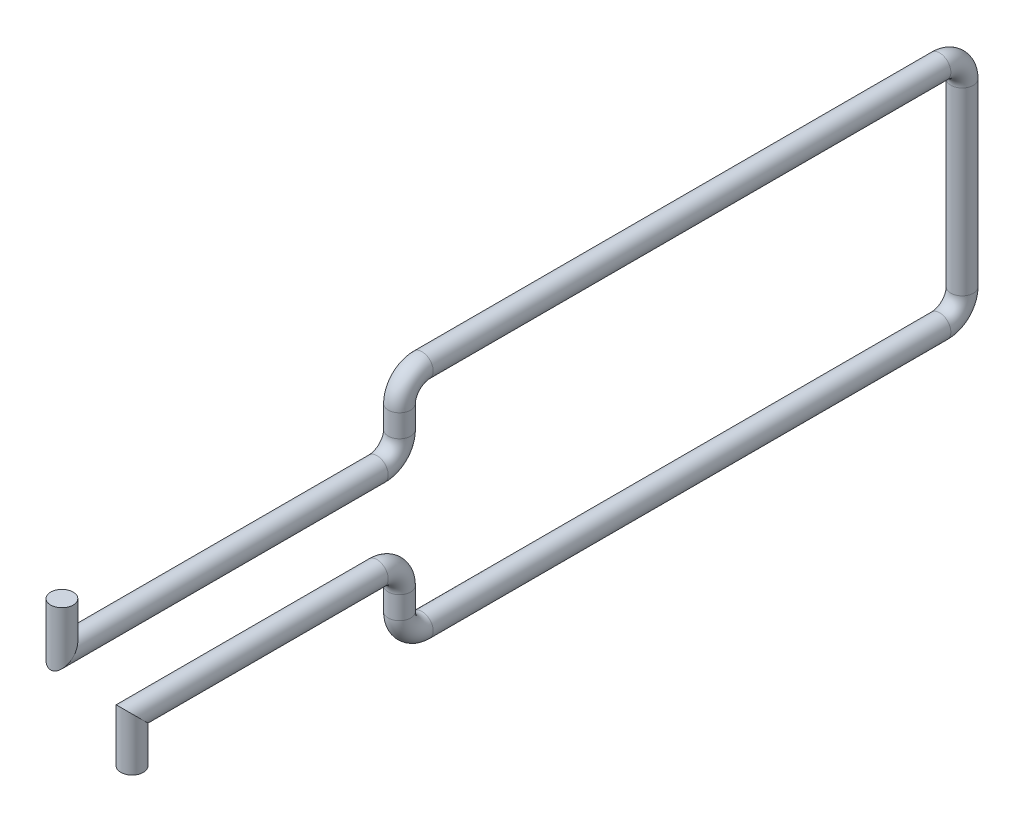
ISO-10303-21;
HEADER;
FILE_DESCRIPTION(('STEP AP214'),'2;1');
FILE_NAME('part.step','',(''),(''),'','','');
FILE_SCHEMA(('AUTOMOTIVE_DESIGN { 1 0 10303 214 1 1 1 1 }'));
ENDSEC;
DATA;
#1=APPLICATION_CONTEXT('core data for automotive mechanical design processes');
#2=APPLICATION_PROTOCOL_DEFINITION('international standard','automotive_design',2000,#1);
#3=PRODUCT_CONTEXT('',#1,'mechanical');
#4=PRODUCT('Part','Part','',(#3));
#5=PRODUCT_RELATED_PRODUCT_CATEGORY('part','',(#4));
#6=PRODUCT_DEFINITION_FORMATION('','',#4);
#7=PRODUCT_DEFINITION_CONTEXT('part definition',#1,'design');
#8=PRODUCT_DEFINITION('design','',#6,#7);
#9=PRODUCT_DEFINITION_SHAPE('','',#8);
#10=(LENGTH_UNIT() NAMED_UNIT(*) SI_UNIT(.MILLI.,.METRE.));
#11=(NAMED_UNIT(*) PLANE_ANGLE_UNIT() SI_UNIT($,.RADIAN.));
#12=(NAMED_UNIT(*) SI_UNIT($,.STERADIAN.) SOLID_ANGLE_UNIT());
#13=UNCERTAINTY_MEASURE_WITH_UNIT(LENGTH_MEASURE(1.E-05),#10,'distance_accuracy_value','');
#14=(GEOMETRIC_REPRESENTATION_CONTEXT(3) GLOBAL_UNCERTAINTY_ASSIGNED_CONTEXT((#13)) GLOBAL_UNIT_ASSIGNED_CONTEXT((#10,
#11,#12)) REPRESENTATION_CONTEXT('',''));
#15=CARTESIAN_POINT('',(0.,0.,0.));
#16=DIRECTION('',(0.,0.,1.));
#17=DIRECTION('',(1.,0.,0.));
#18=AXIS2_PLACEMENT_3D('',#15,#16,#17);
#19=CARTESIAN_POINT('',(0.,-4.00000000000001,-6.23488243508064));
#20=DIRECTION('',(0.,-1.,0.));
#21=DIRECTION('',(0.,0.,-1.));
#22=AXIS2_PLACEMENT_3D('',#19,#20,#21);
#23=CYLINDRICAL_SURFACE('',#22,1.);
#24=CARTESIAN_POINT('',(0.,-4.00000000000001,-6.23488243508064));
#25=DIRECTION('',(0.,-0.707106781186548,0.707106781186547));
#26=DIRECTION('',(0.,0.707106781186547,0.707106781186548));
#27=AXIS2_PLACEMENT_3D('',#24,#25,#26);
#28=ELLIPSE('',#27,1.4142135623731,1.);
#29=CARTESIAN_POINT('',(0.,-3.00000000000001,-5.23488243508063));
#30=VERTEX_POINT('',#29);
#31=EDGE_CURVE('E40',#30,#30,#28,.F.);
#32=ORIENTED_EDGE('',*,*,#31,.F.);
#33=EDGE_LOOP('',(#32));
#34=FACE_BOUND('',#33,.T.);
#35=CARTESIAN_POINT('',(0.,-8.00000000000001,-6.23488243508064));
#36=DIRECTION('',(0.,-1.,0.));
#37=DIRECTION('',(0.,0.,-1.));
#38=AXIS2_PLACEMENT_3D('',#35,#36,#37);
#39=CIRCLE('',#38,1.);
#40=CARTESIAN_POINT('',(0.,-8.00000000000001,-7.23488243508064));
#41=VERTEX_POINT('',#40);
#42=EDGE_CURVE('E11',#41,#41,#39,.T.);
#43=ORIENTED_EDGE('',*,*,#42,.F.);
#44=EDGE_LOOP('',(#43));
#45=FACE_BOUND('',#44,.T.);
#46=ADVANCED_FACE('F34',(#34,#45),#23,.T.);
#47=CARTESIAN_POINT('',(0.,-4.00000000000001,-28.));
#48=DIRECTION('',(0.,0.,1.));
#49=DIRECTION('',(0.,-1.,0.));
#50=AXIS2_PLACEMENT_3D('',#47,#48,#49);
#51=CYLINDRICAL_SURFACE('',#50,1.);
#52=CARTESIAN_POINT('',(0.,-4.00000000000001,-28.));
#53=DIRECTION('',(0.,0.,1.));
#54=DIRECTION('',(0.,-1.,0.));
#55=AXIS2_PLACEMENT_3D('',#52,#53,#54);
#56=CIRCLE('',#55,1.);
#57=CARTESIAN_POINT('',(0.,-3.00000000000001,-28.));
#58=VERTEX_POINT('',#57);
#59=EDGE_CURVE('E44',#58,#58,#56,.T.);
#60=ORIENTED_EDGE('',*,*,#59,.T.);
#61=EDGE_LOOP('',(#60));
#62=FACE_BOUND('',#61,.T.);
#63=ORIENTED_EDGE('',*,*,#31,.T.);
#64=EDGE_LOOP('',(#63));
#65=FACE_BOUND('',#64,.T.);
#66=ADVANCED_FACE('F168',(#62,#65),#51,.T.);
#67=CARTESIAN_POINT('',(0.,-6.00000000000001,-28.));
#68=DIRECTION('',(1.,0.,0.));
#69=DIRECTION('',(0.,0.,-1.));
#70=AXIS2_PLACEMENT_3D('',#67,#68,#69);
#71=TOROIDAL_SURFACE('',#70,2.,1.);
#72=CARTESIAN_POINT('',(0.,-6.00000000000006,-30.));
#73=DIRECTION('',(0.,1.,0.));
#74=DIRECTION('',(0.,0.,1.));
#75=AXIS2_PLACEMENT_3D('',#72,#73,#74);
#76=CIRCLE('',#75,1.);
#77=CARTESIAN_POINT('',(0.,-6.00000000000008,-31.));
#78=VERTEX_POINT('',#77);
#79=EDGE_CURVE('E48',#78,#78,#76,.T.);
#80=CARTESIAN_POINT('',(0.,-6.00000000000001,-28.));
#81=DIRECTION('',(1.,0.,0.));
#82=DIRECTION('',(0.,0.,-1.));
#83=AXIS2_PLACEMENT_3D('',#80,#81,#82);
#84=CIRCLE('',#83,3.);
#85=EDGE_CURVE('',#78,#58,#84,.T.);
#86=ORIENTED_EDGE('',*,*,#79,.T.);
#87=ORIENTED_EDGE('',*,*,#59,.F.);
#88=ORIENTED_EDGE('',*,*,#85,.T.);
#89=ORIENTED_EDGE('',*,*,#85,.F.);
#90=EDGE_LOOP('',(#86,#88,#87,#89));
#91=FACE_BOUND('',#90,.T.);
#92=ADVANCED_FACE('F162',(#91),#71,.T.);
#93=CARTESIAN_POINT('',(0.,-8.00000000000002,-30.));
#94=DIRECTION('',(0.,1.,0.));
#95=DIRECTION('',(0.,0.,1.));
#96=AXIS2_PLACEMENT_3D('',#93,#94,#95);
#97=CYLINDRICAL_SURFACE('',#96,1.);
#98=CARTESIAN_POINT('',(0.,-8.00000000000002,-30.));
#99=DIRECTION('',(0.,1.,0.));
#100=DIRECTION('',(0.,0.,1.));
#101=AXIS2_PLACEMENT_3D('',#98,#99,#100);
#102=CIRCLE('',#101,1.);
#103=CARTESIAN_POINT('',(0.,-8.00000000000003,-29.));
#104=VERTEX_POINT('',#103);
#105=EDGE_CURVE('E53',#104,#104,#102,.T.);
#106=ORIENTED_EDGE('',*,*,#105,.T.);
#107=EDGE_LOOP('',(#106));
#108=FACE_BOUND('',#107,.T.);
#109=ORIENTED_EDGE('',*,*,#79,.F.);
#110=EDGE_LOOP('',(#109));
#111=FACE_BOUND('',#110,.T.);
#112=ADVANCED_FACE('F156',(#108,#111),#97,.T.);
#113=CARTESIAN_POINT('',(0.,-8.00000000000001,-32.));
#114=DIRECTION('',(-1.,0.,0.));
#115=DIRECTION('',(0.,0.,1.));
#116=AXIS2_PLACEMENT_3D('',#113,#114,#115);
#117=TOROIDAL_SURFACE('',#116,2.00000000000001,1.);
#118=CARTESIAN_POINT('',(0.,-10.,-32.));
#119=DIRECTION('',(0.,0.,1.));
#120=DIRECTION('',(0.,-1.,0.));
#121=AXIS2_PLACEMENT_3D('',#118,#119,#120);
#122=CIRCLE('',#121,1.);
#123=CARTESIAN_POINT('',(0.,-11.,-32.0000000000001));
#124=VERTEX_POINT('',#123);
#125=EDGE_CURVE('E56',#124,#124,#122,.T.);
#126=CARTESIAN_POINT('',(0.,-8.00000000000001,-32.));
#127=DIRECTION('',(-1.,0.,0.));
#128=DIRECTION('',(0.,0.,1.));
#129=AXIS2_PLACEMENT_3D('',#126,#127,#128);
#130=CIRCLE('',#129,3.00000000000001);
#131=EDGE_CURVE('',#124,#104,#130,.T.);
#132=ORIENTED_EDGE('',*,*,#125,.T.);
#133=ORIENTED_EDGE('',*,*,#105,.F.);
#134=ORIENTED_EDGE('',*,*,#131,.T.);
#135=ORIENTED_EDGE('',*,*,#131,.F.);
#136=EDGE_LOOP('',(#132,#134,#133,#135));
#137=FACE_BOUND('',#136,.T.);
#138=ADVANCED_FACE('F150',(#137),#117,.T.);
#139=CARTESIAN_POINT('',(0.,-10.,-78.));
#140=DIRECTION('',(0.,0.,1.));
#141=DIRECTION('',(0.,-1.,0.));
#142=AXIS2_PLACEMENT_3D('',#139,#140,#141);
#143=CYLINDRICAL_SURFACE('',#142,1.);
#144=CARTESIAN_POINT('',(0.,-10.,-78.));
#145=DIRECTION('',(0.,0.,1.));
#146=DIRECTION('',(0.,-1.,0.));
#147=AXIS2_PLACEMENT_3D('',#144,#145,#146);
#148=CIRCLE('',#147,1.);
#149=CARTESIAN_POINT('',(0.,-11.,-78.));
#150=VERTEX_POINT('',#149);
#151=EDGE_CURVE('E59',#150,#150,#148,.T.);
#152=ORIENTED_EDGE('',*,*,#151,.T.);
#153=EDGE_LOOP('',(#152));
#154=FACE_BOUND('',#153,.T.);
#155=ORIENTED_EDGE('',*,*,#125,.F.);
#156=EDGE_LOOP('',(#155));
#157=FACE_BOUND('',#156,.T.);
#158=ADVANCED_FACE('F144',(#154,#157),#143,.T.);
#159=CARTESIAN_POINT('',(0.,-8.,-78.));
#160=DIRECTION('',(-1.,0.,0.));
#161=DIRECTION('',(0.,0.,1.));
#162=AXIS2_PLACEMENT_3D('',#159,#160,#161);
#163=TOROIDAL_SURFACE('',#162,2.,1.);
#164=CARTESIAN_POINT('',(0.,-7.99999999999998,-80.));
#165=DIRECTION('',(0.,-1.,0.));
#166=DIRECTION('',(0.,0.,-1.));
#167=AXIS2_PLACEMENT_3D('',#164,#165,#166);
#168=CIRCLE('',#167,1.);
#169=CARTESIAN_POINT('',(0.,-7.99999999999997,-81.));
#170=VERTEX_POINT('',#169);
#171=EDGE_CURVE('E62',#170,#170,#168,.T.);
#172=CARTESIAN_POINT('',(0.,-8.,-78.));
#173=DIRECTION('',(-1.,0.,0.));
#174=DIRECTION('',(0.,0.,1.));
#175=AXIS2_PLACEMENT_3D('',#172,#173,#174);
#176=CIRCLE('',#175,3.);
#177=EDGE_CURVE('',#170,#150,#176,.T.);
#178=ORIENTED_EDGE('',*,*,#171,.T.);
#179=ORIENTED_EDGE('',*,*,#151,.F.);
#180=ORIENTED_EDGE('',*,*,#177,.T.);
#181=ORIENTED_EDGE('',*,*,#177,.F.);
#182=EDGE_LOOP('',(#178,#180,#179,#181));
#183=FACE_BOUND('',#182,.T.);
#184=ADVANCED_FACE('F138',(#183),#163,.T.);
#185=CARTESIAN_POINT('',(0.,7.99999999999999,-80.));
#186=DIRECTION('',(0.,-1.,0.));
#187=DIRECTION('',(0.,0.,-1.));
#188=AXIS2_PLACEMENT_3D('',#185,#186,#187);
#189=CYLINDRICAL_SURFACE('',#188,1.);
#190=CARTESIAN_POINT('',(0.,7.99999999999999,-80.));
#191=DIRECTION('',(0.,-1.,0.));
#192=DIRECTION('',(0.,0.,-1.));
#193=AXIS2_PLACEMENT_3D('',#190,#191,#192);
#194=CIRCLE('',#193,1.);
#195=CARTESIAN_POINT('',(0.,7.99999999999999,-81.));
#196=VERTEX_POINT('',#195);
#197=EDGE_CURVE('E65',#196,#196,#194,.T.);
#198=ORIENTED_EDGE('',*,*,#197,.T.);
#199=EDGE_LOOP('',(#198));
#200=FACE_BOUND('',#199,.T.);
#201=ORIENTED_EDGE('',*,*,#171,.F.);
#202=EDGE_LOOP('',(#201));
#203=FACE_BOUND('',#202,.T.);
#204=ADVANCED_FACE('F132',(#200,#203),#189,.T.);
#205=CARTESIAN_POINT('',(0.,8.,-78.));
#206=DIRECTION('',(-1.,0.,0.));
#207=DIRECTION('',(0.,0.,1.));
#208=AXIS2_PLACEMENT_3D('',#205,#206,#207);
#209=TOROIDAL_SURFACE('',#208,2.,1.);
#210=CARTESIAN_POINT('',(0.,10.,-78.));
#211=DIRECTION('',(0.,0.,-1.));
#212=DIRECTION('',(0.,1.,0.));
#213=AXIS2_PLACEMENT_3D('',#210,#211,#212);
#214=CIRCLE('',#213,1.);
#215=CARTESIAN_POINT('',(0.,11.,-78.));
#216=VERTEX_POINT('',#215);
#217=EDGE_CURVE('E68',#216,#216,#214,.T.);
#218=CARTESIAN_POINT('',(0.,8.,-78.));
#219=DIRECTION('',(-1.,0.,0.));
#220=DIRECTION('',(0.,0.,1.));
#221=AXIS2_PLACEMENT_3D('',#218,#219,#220);
#222=CIRCLE('',#221,3.);
#223=EDGE_CURVE('',#216,#196,#222,.T.);
#224=ORIENTED_EDGE('',*,*,#217,.T.);
#225=ORIENTED_EDGE('',*,*,#197,.F.);
#226=ORIENTED_EDGE('',*,*,#223,.T.);
#227=ORIENTED_EDGE('',*,*,#223,.F.);
#228=EDGE_LOOP('',(#224,#226,#225,#227));
#229=FACE_BOUND('',#228,.T.);
#230=ADVANCED_FACE('F126',(#229),#209,.T.);
#231=CARTESIAN_POINT('',(0.,10.,-32.));
#232=DIRECTION('',(0.,0.,-1.));
#233=DIRECTION('',(0.,1.,0.));
#234=AXIS2_PLACEMENT_3D('',#231,#232,#233);
#235=CYLINDRICAL_SURFACE('',#234,1.);
#236=CARTESIAN_POINT('',(0.,10.,-32.));
#237=DIRECTION('',(0.,0.,-1.));
#238=DIRECTION('',(0.,1.,0.));
#239=AXIS2_PLACEMENT_3D('',#236,#237,#238);
#240=CIRCLE('',#239,1.);
#241=CARTESIAN_POINT('',(0.,11.,-32.));
#242=VERTEX_POINT('',#241);
#243=EDGE_CURVE('E71',#242,#242,#240,.T.);
#244=ORIENTED_EDGE('',*,*,#243,.T.);
#245=EDGE_LOOP('',(#244));
#246=FACE_BOUND('',#245,.T.);
#247=ORIENTED_EDGE('',*,*,#217,.F.);
#248=EDGE_LOOP('',(#247));
#249=FACE_BOUND('',#248,.T.);
#250=ADVANCED_FACE('F120',(#246,#249),#235,.T.);
#251=CARTESIAN_POINT('',(0.,8.,-32.));
#252=DIRECTION('',(-1.,0.,0.));
#253=DIRECTION('',(0.,0.,1.));
#254=AXIS2_PLACEMENT_3D('',#251,#252,#253);
#255=TOROIDAL_SURFACE('',#254,2.,1.);
#256=CARTESIAN_POINT('',(0.,7.99999999999999,-30.));
#257=DIRECTION('',(0.,1.,0.));
#258=DIRECTION('',(0.,0.,1.));
#259=AXIS2_PLACEMENT_3D('',#256,#257,#258);
#260=CIRCLE('',#259,1.);
#261=CARTESIAN_POINT('',(0.,7.99999999999998,-29.));
#262=VERTEX_POINT('',#261);
#263=EDGE_CURVE('E74',#262,#262,#260,.T.);
#264=CARTESIAN_POINT('',(0.,8.,-32.));
#265=DIRECTION('',(-1.,0.,0.));
#266=DIRECTION('',(0.,0.,1.));
#267=AXIS2_PLACEMENT_3D('',#264,#265,#266);
#268=CIRCLE('',#267,3.);
#269=EDGE_CURVE('',#262,#242,#268,.T.);
#270=ORIENTED_EDGE('',*,*,#263,.T.);
#271=ORIENTED_EDGE('',*,*,#243,.F.);
#272=ORIENTED_EDGE('',*,*,#269,.T.);
#273=ORIENTED_EDGE('',*,*,#269,.F.);
#274=EDGE_LOOP('',(#270,#272,#271,#273));
#275=FACE_BOUND('',#274,.T.);
#276=ADVANCED_FACE('F114',(#275),#255,.T.);
#277=CARTESIAN_POINT('',(0.,6.00000000000002,-30.));
#278=DIRECTION('',(0.,1.,0.));
#279=DIRECTION('',(0.,0.,1.));
#280=AXIS2_PLACEMENT_3D('',#277,#278,#279);
#281=CYLINDRICAL_SURFACE('',#280,1.);
#282=CARTESIAN_POINT('',(0.,6.00000000000002,-30.));
#283=DIRECTION('',(0.,1.,0.));
#284=DIRECTION('',(0.,0.,1.));
#285=AXIS2_PLACEMENT_3D('',#282,#283,#284);
#286=CIRCLE('',#285,1.);
#287=CARTESIAN_POINT('',(0.,6.00000000000002,-31.));
#288=VERTEX_POINT('',#287);
#289=EDGE_CURVE('E77',#288,#288,#286,.T.);
#290=ORIENTED_EDGE('',*,*,#289,.T.);
#291=EDGE_LOOP('',(#290));
#292=FACE_BOUND('',#291,.T.);
#293=ORIENTED_EDGE('',*,*,#263,.F.);
#294=EDGE_LOOP('',(#293));
#295=FACE_BOUND('',#294,.T.);
#296=ADVANCED_FACE('F108',(#292,#295),#281,.T.);
#297=CARTESIAN_POINT('',(0.,6.,-28.));
#298=DIRECTION('',(1.,0.,0.));
#299=DIRECTION('',(0.,0.,-1.));
#300=AXIS2_PLACEMENT_3D('',#297,#298,#299);
#301=TOROIDAL_SURFACE('',#300,2.,1.);
#302=CARTESIAN_POINT('',(0.,4.,-28.));
#303=DIRECTION('',(0.,0.,-1.));
#304=DIRECTION('',(0.,1.,0.));
#305=AXIS2_PLACEMENT_3D('',#302,#303,#304);
#306=CIRCLE('',#305,1.);
#307=CARTESIAN_POINT('',(0.,3.,-28.));
#308=VERTEX_POINT('',#307);
#309=EDGE_CURVE('E80',#308,#308,#306,.T.);
#310=CARTESIAN_POINT('',(0.,6.,-28.));
#311=DIRECTION('',(1.,0.,0.));
#312=DIRECTION('',(0.,0.,-1.));
#313=AXIS2_PLACEMENT_3D('',#310,#311,#312);
#314=CIRCLE('',#313,3.);
#315=EDGE_CURVE('',#308,#288,#314,.T.);
#316=ORIENTED_EDGE('',*,*,#309,.T.);
#317=ORIENTED_EDGE('',*,*,#289,.F.);
#318=ORIENTED_EDGE('',*,*,#315,.T.);
#319=ORIENTED_EDGE('',*,*,#315,.F.);
#320=EDGE_LOOP('',(#316,#318,#317,#319));
#321=FACE_BOUND('',#320,.T.);
#322=ADVANCED_FACE('F102',(#321),#301,.T.);
#323=CARTESIAN_POINT('',(0.,4.,0.));
#324=DIRECTION('',(0.,0.,-1.));
#325=DIRECTION('',(-1.,0.,0.));
#326=AXIS2_PLACEMENT_3D('',#323,#324,#325);
#327=CYLINDRICAL_SURFACE('',#326,1.);
#328=CARTESIAN_POINT('',(0.,4.,0.));
#329=DIRECTION('',(0.,-0.707106781186548,-0.707106781186547));
#330=DIRECTION('',(0.,0.707106781186547,-0.707106781186548));
#331=AXIS2_PLACEMENT_3D('',#328,#329,#330);
#332=ELLIPSE('',#331,1.4142135623731,1.);
#333=CARTESIAN_POINT('',(0.,5.,-1.));
#334=VERTEX_POINT('',#333);
#335=EDGE_CURVE('E83',#334,#334,#332,.F.);
#336=ORIENTED_EDGE('',*,*,#335,.F.);
#337=EDGE_LOOP('',(#336));
#338=FACE_BOUND('',#337,.T.);
#339=ORIENTED_EDGE('',*,*,#309,.F.);
#340=EDGE_LOOP('',(#339));
#341=FACE_BOUND('',#340,.T.);
#342=ADVANCED_FACE('F99',(#338,#341),#327,.T.);
#343=CARTESIAN_POINT('',(0.,8.,0.));
#344=DIRECTION('',(0.,1.,0.));
#345=DIRECTION('',(0.,0.,1.));
#346=AXIS2_PLACEMENT_3D('',#343,#344,#345);
#347=PLANE('',#346);
#348=CARTESIAN_POINT('',(0.,8.,0.));
#349=DIRECTION('',(0.,1.,0.));
#350=DIRECTION('',(0.,0.,1.));
#351=AXIS2_PLACEMENT_3D('',#348,#349,#350);
#352=CIRCLE('',#351,1.);
#353=CARTESIAN_POINT('',(0.,8.,1.));
#354=VERTEX_POINT('',#353);
#355=EDGE_CURVE('E86',#354,#354,#352,.T.);
#356=ORIENTED_EDGE('',*,*,#355,.T.);
#357=EDGE_LOOP('',(#356));
#358=FACE_BOUND('',#357,.T.);
#359=ADVANCED_FACE('F90',(#358),#347,.T.);
#360=CARTESIAN_POINT('',(0.,1.17157287525381,0.));
#361=DIRECTION('',(0.,1.,0.));
#362=DIRECTION('',(0.,0.,1.));
#363=AXIS2_PLACEMENT_3D('',#360,#361,#362);
#364=CYLINDRICAL_SURFACE('',#363,1.);
#365=ORIENTED_EDGE('',*,*,#355,.F.);
#366=EDGE_LOOP('',(#365));
#367=FACE_BOUND('',#366,.T.);
#368=ORIENTED_EDGE('',*,*,#335,.T.);
#369=EDGE_LOOP('',(#368));
#370=FACE_BOUND('',#369,.T.);
#371=ADVANCED_FACE('F92',(#367,#370),#364,.T.);
#372=CARTESIAN_POINT('',(0.,-8.00000000000001,-6.23488243508064));
#373=DIRECTION('',(0.,-1.,0.));
#374=DIRECTION('',(0.,0.,-1.));
#375=AXIS2_PLACEMENT_3D('',#372,#373,#374);
#376=PLANE('',#375);
#377=ORIENTED_EDGE('',*,*,#42,.T.);
#378=EDGE_LOOP('',(#377));
#379=FACE_BOUND('',#378,.T.);
#380=ADVANCED_FACE('F95',(#379),#376,.T.);
#381=CLOSED_SHELL('',(#46,#66,#92,#112,#138,#158,#184,#204,#230,#250,#276,#296,#322,#342,#359,
#371,#380));
#382=MANIFOLD_SOLID_BREP('B2',#381);
#383=ADVANCED_BREP_SHAPE_REPRESENTATION('',(#18,#382),#14);
#384=SHAPE_DEFINITION_REPRESENTATION(#9,#383);
ENDSEC;
END-ISO-10303-21;
